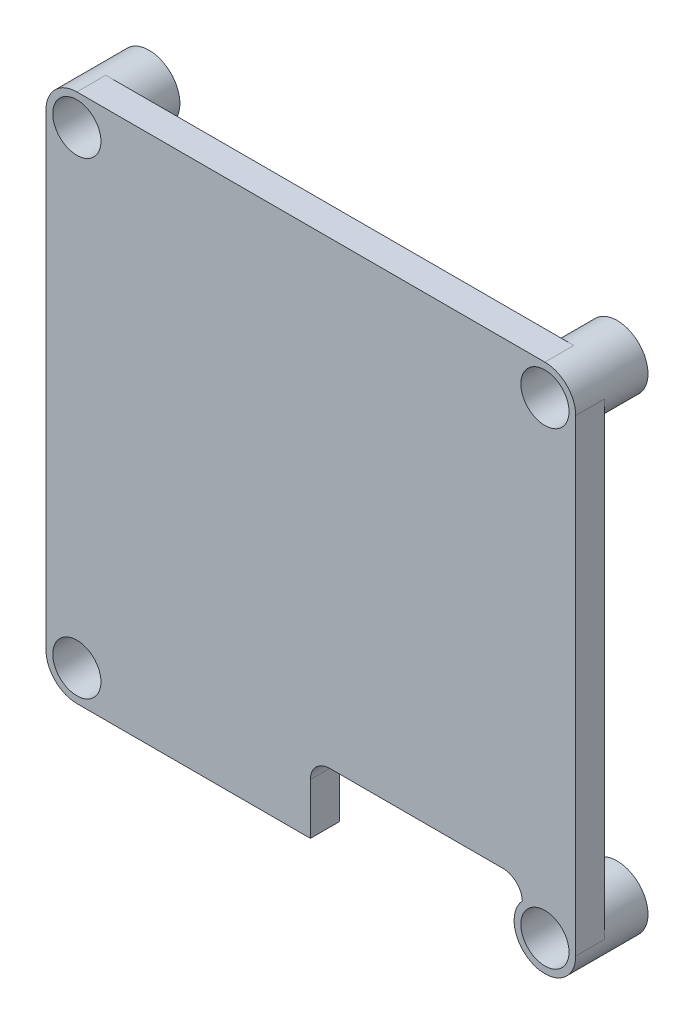
ISO-10303-21;
HEADER;
FILE_DESCRIPTION(('STEP AP214'),'2;1');
FILE_NAME('part.step','',(''),(''),'','','');
FILE_SCHEMA(('AUTOMOTIVE_DESIGN { 1 0 10303 214 1 1 1 1 }'));
ENDSEC;
DATA;
#1=APPLICATION_CONTEXT('core data for automotive mechanical design processes');
#2=APPLICATION_PROTOCOL_DEFINITION('international standard','automotive_design',2000,#1);
#3=PRODUCT_CONTEXT('',#1,'mechanical');
#4=PRODUCT('Part','Part','',(#3));
#5=PRODUCT_RELATED_PRODUCT_CATEGORY('part','',(#4));
#6=PRODUCT_DEFINITION_FORMATION('','',#4);
#7=PRODUCT_DEFINITION_CONTEXT('part definition',#1,'design');
#8=PRODUCT_DEFINITION('design','',#6,#7);
#9=PRODUCT_DEFINITION_SHAPE('','',#8);
#10=(LENGTH_UNIT() NAMED_UNIT(*) SI_UNIT(.MILLI.,.METRE.));
#11=(NAMED_UNIT(*) PLANE_ANGLE_UNIT() SI_UNIT($,.RADIAN.));
#12=(NAMED_UNIT(*) SI_UNIT($,.STERADIAN.) SOLID_ANGLE_UNIT());
#13=UNCERTAINTY_MEASURE_WITH_UNIT(LENGTH_MEASURE(1.E-05),#10,'distance_accuracy_value','');
#14=(GEOMETRIC_REPRESENTATION_CONTEXT(3) GLOBAL_UNCERTAINTY_ASSIGNED_CONTEXT((#13)) GLOBAL_UNIT_ASSIGNED_CONTEXT((#10,
#11,#12)) REPRESENTATION_CONTEXT('',''));
#15=CARTESIAN_POINT('',(0.,0.,0.));
#16=DIRECTION('',(0.,0.,1.));
#17=DIRECTION('',(1.,0.,0.));
#18=AXIS2_PLACEMENT_3D('',#15,#16,#17);
#19=CARTESIAN_POINT('',(0.,0.,2.25));
#20=DIRECTION('',(0.,0.,1.));
#21=DIRECTION('',(1.,0.,0.));
#22=AXIS2_PLACEMENT_3D('',#19,#20,#21);
#23=PLANE('',#22);
#24=CARTESIAN_POINT('',(-12.15,-12.15,2.25));
#25=DIRECTION('',(0.,0.,1.));
#26=DIRECTION('',(1.,0.,0.));
#27=AXIS2_PLACEMENT_3D('',#24,#25,#26);
#28=CIRCLE('',#27,1.6);
#29=CARTESIAN_POINT('',(-12.15,-13.75,2.25));
#30=VERTEX_POINT('',#29);
#31=CARTESIAN_POINT('',(-13.75,-12.15,2.25));
#32=VERTEX_POINT('',#31);
#33=EDGE_CURVE('E123',#30,#32,#28,.T.);
#34=ORIENTED_EDGE('',*,*,#33,.T.);
#35=DIRECTION('',(0.,-1.,0.));
#36=VECTOR('',#35,1.);
#37=CARTESIAN_POINT('',(-13.75,0.,2.25));
#38=LINE('',#37,#36);
#39=CARTESIAN_POINT('',(-13.75,12.15,2.25));
#40=VERTEX_POINT('',#39);
#41=EDGE_CURVE('E126',#40,#32,#38,.T.);
#42=ORIENTED_EDGE('',*,*,#41,.F.);
#43=CARTESIAN_POINT('',(-12.15,12.15,2.25));
#44=DIRECTION('',(0.,0.,1.));
#45=DIRECTION('',(1.,0.,0.));
#46=AXIS2_PLACEMENT_3D('',#43,#44,#45);
#47=CIRCLE('',#46,1.6);
#48=CARTESIAN_POINT('',(-12.15,13.75,2.25));
#49=VERTEX_POINT('',#48);
#50=EDGE_CURVE('E190',#40,#49,#47,.T.);
#51=ORIENTED_EDGE('',*,*,#50,.T.);
#52=DIRECTION('',(1.,0.,0.));
#53=VECTOR('',#52,1.);
#54=CARTESIAN_POINT('',(0.,13.75,2.25));
#55=LINE('',#54,#53);
#56=CARTESIAN_POINT('',(12.15,13.75,2.25));
#57=VERTEX_POINT('',#56);
#58=EDGE_CURVE('E166',#49,#57,#55,.T.);
#59=ORIENTED_EDGE('',*,*,#58,.T.);
#60=CARTESIAN_POINT('',(12.15,12.15,2.25));
#61=DIRECTION('',(0.,0.,1.));
#62=DIRECTION('',(1.,0.,0.));
#63=AXIS2_PLACEMENT_3D('',#60,#61,#62);
#64=CIRCLE('',#63,1.6);
#65=CARTESIAN_POINT('',(13.75,12.15,2.25));
#66=VERTEX_POINT('',#65);
#67=EDGE_CURVE('E149',#57,#66,#64,.T.);
#68=ORIENTED_EDGE('',*,*,#67,.T.);
#69=DIRECTION('',(0.,-1.,0.));
#70=VECTOR('',#69,1.);
#71=CARTESIAN_POINT('',(13.75,0.,2.25));
#72=LINE('',#71,#70);
#73=CARTESIAN_POINT('',(13.75,-12.15,2.25));
#74=VERTEX_POINT('',#73);
#75=EDGE_CURVE('E163',#66,#74,#72,.T.);
#76=ORIENTED_EDGE('',*,*,#75,.T.);
#77=CARTESIAN_POINT('',(12.15,-12.15,2.25));
#78=DIRECTION('',(0.,0.,1.));
#79=DIRECTION('',(1.,0.,0.));
#80=AXIS2_PLACEMENT_3D('',#77,#78,#79);
#81=CIRCLE('',#80,1.6);
#82=CARTESIAN_POINT('',(10.975,-11.0640096685513,2.25));
#83=VERTEX_POINT('',#82);
#84=EDGE_CURVE('E228',#74,#83,#81,.T.);
#85=ORIENTED_EDGE('',*,*,#84,.T.);
#86=CARTESIAN_POINT('',(9.97564786184138,-11.1,2.25));
#87=DIRECTION('',(0.,0.,1.));
#88=DIRECTION('',(1.,0.,0.));
#89=AXIS2_PLACEMENT_3D('',#86,#87,#88);
#90=CIRCLE('',#89,1.);
#91=CARTESIAN_POINT('',(9.97564786184138,-10.1,2.25));
#92=VERTEX_POINT('',#91);
#93=EDGE_CURVE('E203',#83,#92,#90,.T.);
#94=ORIENTED_EDGE('',*,*,#93,.T.);
#95=DIRECTION('',(1.,0.,0.));
#96=VECTOR('',#95,1.);
#97=CARTESIAN_POINT('',(0.,-10.1,2.25));
#98=LINE('',#97,#96);
#99=CARTESIAN_POINT('',(0.975000000000001,-10.1,2.25));
#100=VERTEX_POINT('',#99);
#101=EDGE_CURVE('E160',#100,#92,#98,.T.);
#102=ORIENTED_EDGE('',*,*,#101,.F.);
#103=CARTESIAN_POINT('',(0.975000000000001,-11.1,2.25));
#104=DIRECTION('',(0.,0.,1.));
#105=DIRECTION('',(1.,0.,0.));
#106=AXIS2_PLACEMENT_3D('',#103,#104,#105);
#107=CIRCLE('',#106,1.);
#108=CARTESIAN_POINT('',(-0.0249999999999993,-11.1,2.25));
#109=VERTEX_POINT('',#108);
#110=EDGE_CURVE('E43',#100,#109,#107,.T.);
#111=ORIENTED_EDGE('',*,*,#110,.T.);
#112=DIRECTION('',(0.,1.,0.));
#113=VECTOR('',#112,1.);
#114=CARTESIAN_POINT('',(-0.0250000000000007,0.,2.25));
#115=LINE('',#114,#113);
#116=CARTESIAN_POINT('',(-0.024999999999999,-13.75,2.25));
#117=VERTEX_POINT('',#116);
#118=EDGE_CURVE('E151',#117,#109,#115,.T.);
#119=ORIENTED_EDGE('',*,*,#118,.F.);
#120=DIRECTION('',(1.,0.,0.));
#121=VECTOR('',#120,1.);
#122=CARTESIAN_POINT('',(0.,-13.75,2.25));
#123=LINE('',#122,#121);
#124=EDGE_CURVE('E127',#30,#117,#123,.T.);
#125=ORIENTED_EDGE('',*,*,#124,.F.);
#126=EDGE_LOOP('',(#34,#42,#51,#59,#68,#76,#85,#94,#102,#111,#119,#125));
#127=FACE_BOUND('',#126,.T.);
#128=ADVANCED_FACE('F35',(#127),#23,.F.);
#129=CARTESIAN_POINT('',(-12.15,12.15,2.25));
#130=DIRECTION('',(0.,0.,-1.));
#131=DIRECTION('',(-1.,0.,0.));
#132=AXIS2_PLACEMENT_3D('',#129,#130,#131);
#133=CYLINDRICAL_SURFACE('',#132,1.25);
#134=CARTESIAN_POINT('',(-12.15,12.15,0.));
#135=DIRECTION('',(0.,0.,1.));
#136=DIRECTION('',(1.,0.,0.));
#137=AXIS2_PLACEMENT_3D('',#134,#135,#136);
#138=CIRCLE('',#137,1.25);
#139=CARTESIAN_POINT('',(-10.9,12.15,0.));
#140=VERTEX_POINT('',#139);
#141=EDGE_CURVE('E142',#140,#140,#138,.T.);
#142=ORIENTED_EDGE('',*,*,#141,.F.);
#143=EDGE_LOOP('',(#142));
#144=FACE_BOUND('',#143,.T.);
#145=CARTESIAN_POINT('',(-12.15,12.15,3.75));
#146=DIRECTION('',(0.,0.,1.));
#147=DIRECTION('',(1.,0.,0.));
#148=AXIS2_PLACEMENT_3D('',#145,#146,#147);
#149=CIRCLE('',#148,1.25);
#150=CARTESIAN_POINT('',(-10.9,12.15,3.75));
#151=VERTEX_POINT('',#150);
#152=EDGE_CURVE('E259',#151,#151,#149,.F.);
#153=ORIENTED_EDGE('',*,*,#152,.F.);
#154=EDGE_LOOP('',(#153));
#155=FACE_BOUND('',#154,.T.);
#156=ADVANCED_FACE('F288',(#144,#155),#133,.F.);
#157=CARTESIAN_POINT('',(-12.15,12.15,2.25));
#158=DIRECTION('',(0.,0.,-1.));
#159=DIRECTION('',(-1.,0.,0.));
#160=AXIS2_PLACEMENT_3D('',#157,#158,#159);
#161=CYLINDRICAL_SURFACE('',#160,1.6);
#162=ORIENTED_EDGE('',*,*,#50,.F.);
#163=DIRECTION('',(0.,0.,-1.));
#164=VECTOR('',#163,1.);
#165=CARTESIAN_POINT('',(-13.75,12.15,3.75));
#166=LINE('',#165,#164);
#167=CARTESIAN_POINT('',(-13.75,12.15,3.75));
#168=VERTEX_POINT('',#167);
#169=EDGE_CURVE('E148',#168,#40,#166,.T.);
#170=ORIENTED_EDGE('',*,*,#169,.F.);
#171=CARTESIAN_POINT('',(-12.15,12.15,3.75));
#172=DIRECTION('',(0.,0.,1.));
#173=DIRECTION('',(1.,0.,0.));
#174=AXIS2_PLACEMENT_3D('',#171,#172,#173);
#175=CIRCLE('',#174,1.6);
#176=CARTESIAN_POINT('',(-12.15,13.75,3.75));
#177=VERTEX_POINT('',#176);
#178=EDGE_CURVE('E257',#177,#168,#175,.T.);
#179=ORIENTED_EDGE('',*,*,#178,.F.);
#180=DIRECTION('',(0.,0.,-1.));
#181=VECTOR('',#180,1.);
#182=CARTESIAN_POINT('',(-12.15,13.75,3.75));
#183=LINE('',#182,#181);
#184=EDGE_CURVE('E171',#177,#49,#183,.T.);
#185=ORIENTED_EDGE('',*,*,#184,.T.);
#186=EDGE_LOOP('',(#162,#170,#179,#185));
#187=FACE_BOUND('',#186,.T.);
#188=CARTESIAN_POINT('',(-12.15,12.15,0.));
#189=DIRECTION('',(0.,0.,1.));
#190=DIRECTION('',(1.,0.,0.));
#191=AXIS2_PLACEMENT_3D('',#188,#189,#190);
#192=CIRCLE('',#191,1.6);
#193=CARTESIAN_POINT('',(-10.55,12.15,0.));
#194=VERTEX_POINT('',#193);
#195=EDGE_CURVE('E193',#194,#194,#192,.T.);
#196=ORIENTED_EDGE('',*,*,#195,.T.);
#197=EDGE_LOOP('',(#196));
#198=FACE_BOUND('',#197,.T.);
#199=ADVANCED_FACE('F292',(#187,#198),#161,.T.);
#200=CARTESIAN_POINT('',(0.,0.,0.));
#201=DIRECTION('',(0.,0.,1.));
#202=DIRECTION('',(1.,0.,0.));
#203=AXIS2_PLACEMENT_3D('',#200,#201,#202);
#204=PLANE('',#203);
#205=ORIENTED_EDGE('',*,*,#141,.T.);
#206=EDGE_LOOP('',(#205));
#207=FACE_BOUND('',#206,.T.);
#208=ORIENTED_EDGE('',*,*,#195,.F.);
#209=EDGE_LOOP('',(#208));
#210=FACE_BOUND('',#209,.T.);
#211=ADVANCED_FACE('F331',(#207,#210),#204,.F.);
#212=CARTESIAN_POINT('',(-13.75,0.,3.75));
#213=DIRECTION('',(1.,0.,0.));
#214=DIRECTION('',(0.,1.,0.));
#215=AXIS2_PLACEMENT_3D('',#212,#213,#214);
#216=PLANE('',#215);
#217=ORIENTED_EDGE('',*,*,#41,.T.);
#218=DIRECTION('',(0.,0.,-1.));
#219=VECTOR('',#218,1.);
#220=CARTESIAN_POINT('',(-13.75,-12.15,3.75));
#221=LINE('',#220,#219);
#222=CARTESIAN_POINT('',(-13.75,-12.15,3.75));
#223=VERTEX_POINT('',#222);
#224=EDGE_CURVE('E135',#223,#32,#221,.T.);
#225=ORIENTED_EDGE('',*,*,#224,.F.);
#226=DIRECTION('',(0.,-1.,0.));
#227=VECTOR('',#226,1.);
#228=CARTESIAN_POINT('',(-13.75,0.,3.75));
#229=LINE('',#228,#227);
#230=EDGE_CURVE('E169',#168,#223,#229,.T.);
#231=ORIENTED_EDGE('',*,*,#230,.F.);
#232=ORIENTED_EDGE('',*,*,#169,.T.);
#233=EDGE_LOOP('',(#217,#225,#231,#232));
#234=FACE_BOUND('',#233,.T.);
#235=ADVANCED_FACE('F146',(#234),#216,.F.);
#236=CARTESIAN_POINT('',(-12.15,-12.15,3.75));
#237=DIRECTION('',(0.,0.,-1.));
#238=DIRECTION('',(-1.,0.,0.));
#239=AXIS2_PLACEMENT_3D('',#236,#237,#238);
#240=CYLINDRICAL_SURFACE('',#239,1.6);
#241=ORIENTED_EDGE('',*,*,#224,.T.);
#242=ORIENTED_EDGE('',*,*,#33,.F.);
#243=DIRECTION('',(0.,0.,-1.));
#244=VECTOR('',#243,1.);
#245=CARTESIAN_POINT('',(-12.15,-13.75,3.75));
#246=LINE('',#245,#244);
#247=CARTESIAN_POINT('',(-12.15,-13.75,3.75));
#248=VERTEX_POINT('',#247);
#249=EDGE_CURVE('E143',#248,#30,#246,.T.);
#250=ORIENTED_EDGE('',*,*,#249,.F.);
#251=CARTESIAN_POINT('',(-12.15,-12.15,3.75));
#252=DIRECTION('',(0.,0.,1.));
#253=DIRECTION('',(1.,0.,0.));
#254=AXIS2_PLACEMENT_3D('',#251,#252,#253);
#255=CIRCLE('',#254,1.6);
#256=EDGE_CURVE('E138',#223,#248,#255,.T.);
#257=ORIENTED_EDGE('',*,*,#256,.F.);
#258=EDGE_LOOP('',(#241,#242,#250,#257));
#259=FACE_BOUND('',#258,.T.);
#260=CARTESIAN_POINT('',(-12.15,-12.15,0.));
#261=DIRECTION('',(0.,0.,1.));
#262=DIRECTION('',(1.,0.,0.));
#263=AXIS2_PLACEMENT_3D('',#260,#261,#262);
#264=CIRCLE('',#263,1.6);
#265=CARTESIAN_POINT('',(-10.55,-12.15,0.));
#266=VERTEX_POINT('',#265);
#267=EDGE_CURVE('E132',#266,#266,#264,.T.);
#268=ORIENTED_EDGE('',*,*,#267,.T.);
#269=EDGE_LOOP('',(#268));
#270=FACE_BOUND('',#269,.T.);
#271=ADVANCED_FACE('F136',(#259,#270),#240,.T.);
#272=CARTESIAN_POINT('',(0.,-13.75,3.75));
#273=DIRECTION('',(0.,1.,0.));
#274=DIRECTION('',(0.,0.,1.));
#275=AXIS2_PLACEMENT_3D('',#272,#273,#274);
#276=PLANE('',#275);
#277=ORIENTED_EDGE('',*,*,#124,.T.);
#278=DIRECTION('',(0.,0.,-1.));
#279=VECTOR('',#278,1.);
#280=CARTESIAN_POINT('',(-0.024999999999999,-13.75,3.75));
#281=LINE('',#280,#279);
#282=CARTESIAN_POINT('',(-0.024999999999999,-13.75,3.75));
#283=VERTEX_POINT('',#282);
#284=EDGE_CURVE('E186',#283,#117,#281,.T.);
#285=ORIENTED_EDGE('',*,*,#284,.F.);
#286=DIRECTION('',(1.,0.,0.));
#287=VECTOR('',#286,1.);
#288=CARTESIAN_POINT('',(0.,-13.75,3.75));
#289=LINE('',#288,#287);
#290=EDGE_CURVE('E246',#248,#283,#289,.T.);
#291=ORIENTED_EDGE('',*,*,#290,.F.);
#292=ORIENTED_EDGE('',*,*,#249,.T.);
#293=EDGE_LOOP('',(#277,#285,#291,#292));
#294=FACE_BOUND('',#293,.T.);
#295=ADVANCED_FACE('F323',(#294),#276,.F.);
#296=CARTESIAN_POINT('',(-0.0250000000000007,0.,3.75));
#297=DIRECTION('',(-1.,0.,0.));
#298=DIRECTION('',(0.,-1.,0.));
#299=AXIS2_PLACEMENT_3D('',#296,#297,#298);
#300=PLANE('',#299);
#301=ORIENTED_EDGE('',*,*,#118,.T.);
#302=DIRECTION('',(0.,0.,-1.));
#303=VECTOR('',#302,1.);
#304=CARTESIAN_POINT('',(-0.0249999999999993,-11.1,3.75));
#305=LINE('',#304,#303);
#306=CARTESIAN_POINT('',(-0.0249999999999993,-11.1,3.75));
#307=VERTEX_POINT('',#306);
#308=EDGE_CURVE('E50',#109,#307,#305,.F.);
#309=ORIENTED_EDGE('',*,*,#308,.T.);
#310=DIRECTION('',(0.,1.,0.));
#311=VECTOR('',#310,1.);
#312=CARTESIAN_POINT('',(-0.0250000000000007,0.,3.75));
#313=LINE('',#312,#311);
#314=EDGE_CURVE('E248',#283,#307,#313,.T.);
#315=ORIENTED_EDGE('',*,*,#314,.F.);
#316=ORIENTED_EDGE('',*,*,#284,.T.);
#317=EDGE_LOOP('',(#301,#309,#315,#316));
#318=FACE_BOUND('',#317,.T.);
#319=ADVANCED_FACE('F319',(#318),#300,.F.);
#320=CARTESIAN_POINT('',(0.,-10.1,3.75));
#321=DIRECTION('',(0.,1.,0.));
#322=DIRECTION('',(0.,0.,1.));
#323=AXIS2_PLACEMENT_3D('',#320,#321,#322);
#324=PLANE('',#323);
#325=ORIENTED_EDGE('',*,*,#101,.T.);
#326=DIRECTION('',(0.,0.,-1.));
#327=VECTOR('',#326,1.);
#328=CARTESIAN_POINT('',(9.97564786184138,-10.1,3.75));
#329=LINE('',#328,#327);
#330=CARTESIAN_POINT('',(9.97564786184138,-10.1,3.75));
#331=VERTEX_POINT('',#330);
#332=EDGE_CURVE('E200',#92,#331,#329,.F.);
#333=ORIENTED_EDGE('',*,*,#332,.T.);
#334=DIRECTION('',(1.,0.,0.));
#335=VECTOR('',#334,1.);
#336=CARTESIAN_POINT('',(0.,-10.1,3.75));
#337=LINE('',#336,#335);
#338=CARTESIAN_POINT('',(0.975000000000001,-10.1,3.75));
#339=VERTEX_POINT('',#338);
#340=EDGE_CURVE('E216',#339,#331,#337,.T.);
#341=ORIENTED_EDGE('',*,*,#340,.F.);
#342=DIRECTION('',(0.,0.,-1.));
#343=VECTOR('',#342,1.);
#344=CARTESIAN_POINT('',(0.975000000000001,-10.1,2.25));
#345=LINE('',#344,#343);
#346=EDGE_CURVE('E192',#339,#100,#345,.T.);
#347=ORIENTED_EDGE('',*,*,#346,.T.);
#348=EDGE_LOOP('',(#325,#333,#341,#347));
#349=FACE_BOUND('',#348,.T.);
#350=ADVANCED_FACE('F316',(#349),#324,.F.);
#351=CARTESIAN_POINT('',(12.15,-12.15,3.75));
#352=DIRECTION('',(0.,0.,-1.));
#353=DIRECTION('',(-1.,0.,0.));
#354=AXIS2_PLACEMENT_3D('',#351,#352,#353);
#355=CYLINDRICAL_SURFACE('',#354,1.6);
#356=DIRECTION('',(0.,0.,-1.));
#357=VECTOR('',#356,1.);
#358=CARTESIAN_POINT('',(10.975,-11.0640096685513,3.75));
#359=LINE('',#358,#357);
#360=CARTESIAN_POINT('',(10.975,-11.0640096685513,3.75));
#361=VERTEX_POINT('',#360);
#362=EDGE_CURVE('E183',#361,#83,#359,.T.);
#363=ORIENTED_EDGE('',*,*,#362,.T.);
#364=ORIENTED_EDGE('',*,*,#84,.F.);
#365=DIRECTION('',(0.,0.,-1.));
#366=VECTOR('',#365,1.);
#367=CARTESIAN_POINT('',(13.75,-12.15,3.75));
#368=LINE('',#367,#366);
#369=CARTESIAN_POINT('',(13.75,-12.15,3.75));
#370=VERTEX_POINT('',#369);
#371=EDGE_CURVE('E180',#370,#74,#368,.T.);
#372=ORIENTED_EDGE('',*,*,#371,.F.);
#373=CARTESIAN_POINT('',(12.15,-12.15,3.75));
#374=DIRECTION('',(0.,0.,1.));
#375=DIRECTION('',(1.,0.,0.));
#376=AXIS2_PLACEMENT_3D('',#373,#374,#375);
#377=CIRCLE('',#376,1.6);
#378=EDGE_CURVE('E213',#361,#370,#377,.T.);
#379=ORIENTED_EDGE('',*,*,#378,.F.);
#380=EDGE_LOOP('',(#363,#364,#372,#379));
#381=FACE_BOUND('',#380,.T.);
#382=CARTESIAN_POINT('',(12.15,-12.15,0.));
#383=DIRECTION('',(0.,0.,1.));
#384=DIRECTION('',(1.,0.,0.));
#385=AXIS2_PLACEMENT_3D('',#382,#383,#384);
#386=CIRCLE('',#385,1.6);
#387=CARTESIAN_POINT('',(13.75,-12.15,0.));
#388=VERTEX_POINT('',#387);
#389=EDGE_CURVE('E231',#388,#388,#386,.T.);
#390=ORIENTED_EDGE('',*,*,#389,.T.);
#391=EDGE_LOOP('',(#390));
#392=FACE_BOUND('',#391,.T.);
#393=ADVANCED_FACE('F221',(#381,#392),#355,.T.);
#394=CARTESIAN_POINT('',(13.75,0.,3.75));
#395=DIRECTION('',(1.,0.,0.));
#396=DIRECTION('',(0.,1.,0.));
#397=AXIS2_PLACEMENT_3D('',#394,#395,#396);
#398=PLANE('',#397);
#399=ORIENTED_EDGE('',*,*,#75,.F.);
#400=DIRECTION('',(0.,0.,-1.));
#401=VECTOR('',#400,1.);
#402=CARTESIAN_POINT('',(13.75,12.15,3.75));
#403=LINE('',#402,#401);
#404=CARTESIAN_POINT('',(13.75,12.15,3.75));
#405=VERTEX_POINT('',#404);
#406=EDGE_CURVE('E177',#405,#66,#403,.T.);
#407=ORIENTED_EDGE('',*,*,#406,.F.);
#408=DIRECTION('',(0.,-1.,0.));
#409=VECTOR('',#408,1.);
#410=CARTESIAN_POINT('',(13.75,0.,3.75));
#411=LINE('',#410,#409);
#412=EDGE_CURVE('E224',#405,#370,#411,.T.);
#413=ORIENTED_EDGE('',*,*,#412,.T.);
#414=ORIENTED_EDGE('',*,*,#371,.T.);
#415=EDGE_LOOP('',(#399,#407,#413,#414));
#416=FACE_BOUND('',#415,.T.);
#417=ADVANCED_FACE('F309',(#416),#398,.T.);
#418=CARTESIAN_POINT('',(12.15,12.15,3.75));
#419=DIRECTION('',(0.,0.,-1.));
#420=DIRECTION('',(-1.,0.,0.));
#421=AXIS2_PLACEMENT_3D('',#418,#419,#420);
#422=CYLINDRICAL_SURFACE('',#421,1.6);
#423=ORIENTED_EDGE('',*,*,#406,.T.);
#424=ORIENTED_EDGE('',*,*,#67,.F.);
#425=DIRECTION('',(0.,0.,-1.));
#426=VECTOR('',#425,1.);
#427=CARTESIAN_POINT('',(12.15,13.75,3.75));
#428=LINE('',#427,#426);
#429=CARTESIAN_POINT('',(12.15,13.75,3.75));
#430=VERTEX_POINT('',#429);
#431=EDGE_CURVE('E174',#430,#57,#428,.T.);
#432=ORIENTED_EDGE('',*,*,#431,.F.);
#433=CARTESIAN_POINT('',(12.15,12.15,3.75));
#434=DIRECTION('',(0.,0.,1.));
#435=DIRECTION('',(1.,0.,0.));
#436=AXIS2_PLACEMENT_3D('',#433,#434,#435);
#437=CIRCLE('',#436,1.6);
#438=EDGE_CURVE('E252',#405,#430,#437,.T.);
#439=ORIENTED_EDGE('',*,*,#438,.F.);
#440=EDGE_LOOP('',(#423,#424,#432,#439));
#441=FACE_BOUND('',#440,.T.);
#442=CARTESIAN_POINT('',(12.15,12.15,0.));
#443=DIRECTION('',(0.,0.,1.));
#444=DIRECTION('',(1.,0.,0.));
#445=AXIS2_PLACEMENT_3D('',#442,#443,#444);
#446=CIRCLE('',#445,1.6);
#447=CARTESIAN_POINT('',(13.75,12.15,0.));
#448=VERTEX_POINT('',#447);
#449=EDGE_CURVE('E153',#448,#448,#446,.T.);
#450=ORIENTED_EDGE('',*,*,#449,.T.);
#451=EDGE_LOOP('',(#450));
#452=FACE_BOUND('',#451,.T.);
#453=ADVANCED_FACE('F305',(#441,#452),#422,.T.);
#454=CARTESIAN_POINT('',(0.,13.75,3.75));
#455=DIRECTION('',(0.,1.,0.));
#456=DIRECTION('',(0.,0.,1.));
#457=AXIS2_PLACEMENT_3D('',#454,#455,#456);
#458=PLANE('',#457);
#459=ORIENTED_EDGE('',*,*,#58,.F.);
#460=ORIENTED_EDGE('',*,*,#184,.F.);
#461=DIRECTION('',(1.,0.,0.));
#462=VECTOR('',#461,1.);
#463=CARTESIAN_POINT('',(0.,13.75,3.75));
#464=LINE('',#463,#462);
#465=EDGE_CURVE('E254',#177,#430,#464,.T.);
#466=ORIENTED_EDGE('',*,*,#465,.T.);
#467=ORIENTED_EDGE('',*,*,#431,.T.);
#468=EDGE_LOOP('',(#459,#460,#466,#467));
#469=FACE_BOUND('',#468,.T.);
#470=ADVANCED_FACE('F299',(#469),#458,.T.);
#471=CARTESIAN_POINT('',(12.15,-12.15,3.75));
#472=DIRECTION('',(0.,0.,-1.));
#473=DIRECTION('',(-1.,0.,0.));
#474=AXIS2_PLACEMENT_3D('',#471,#472,#473);
#475=CYLINDRICAL_SURFACE('',#474,1.25);
#476=CARTESIAN_POINT('',(12.15,-12.15,3.75));
#477=DIRECTION('',(0.,0.,1.));
#478=DIRECTION('',(1.,0.,0.));
#479=AXIS2_PLACEMENT_3D('',#476,#477,#478);
#480=CIRCLE('',#479,1.25);
#481=CARTESIAN_POINT('',(13.4,-12.15,3.75));
#482=VERTEX_POINT('',#481);
#483=EDGE_CURVE('E264',#482,#482,#480,.T.);
#484=ORIENTED_EDGE('',*,*,#483,.T.);
#485=EDGE_LOOP('',(#484));
#486=FACE_BOUND('',#485,.T.);
#487=CARTESIAN_POINT('',(12.15,-12.15,0.));
#488=DIRECTION('',(0.,0.,1.));
#489=DIRECTION('',(1.,0.,0.));
#490=AXIS2_PLACEMENT_3D('',#487,#488,#489);
#491=CIRCLE('',#490,1.25);
#492=CARTESIAN_POINT('',(13.4,-12.15,0.));
#493=VERTEX_POINT('',#492);
#494=EDGE_CURVE('E131',#493,#493,#491,.T.);
#495=ORIENTED_EDGE('',*,*,#494,.F.);
#496=EDGE_LOOP('',(#495));
#497=FACE_BOUND('',#496,.T.);
#498=ADVANCED_FACE('F296',(#486,#497),#475,.F.);
#499=CARTESIAN_POINT('',(12.15,12.15,3.75));
#500=DIRECTION('',(0.,0.,-1.));
#501=DIRECTION('',(-1.,0.,0.));
#502=AXIS2_PLACEMENT_3D('',#499,#500,#501);
#503=CYLINDRICAL_SURFACE('',#502,1.25);
#504=CARTESIAN_POINT('',(12.15,12.15,3.75));
#505=DIRECTION('',(0.,0.,1.));
#506=DIRECTION('',(1.,0.,0.));
#507=AXIS2_PLACEMENT_3D('',#504,#505,#506);
#508=CIRCLE('',#507,1.25);
#509=CARTESIAN_POINT('',(13.4,12.15,3.75));
#510=VERTEX_POINT('',#509);
#511=EDGE_CURVE('E262',#510,#510,#508,.T.);
#512=ORIENTED_EDGE('',*,*,#511,.T.);
#513=EDGE_LOOP('',(#512));
#514=FACE_BOUND('',#513,.T.);
#515=CARTESIAN_POINT('',(12.15,12.15,0.));
#516=DIRECTION('',(0.,0.,1.));
#517=DIRECTION('',(1.,0.,0.));
#518=AXIS2_PLACEMENT_3D('',#515,#516,#517);
#519=CIRCLE('',#518,1.25);
#520=CARTESIAN_POINT('',(13.4,12.15,0.));
#521=VERTEX_POINT('',#520);
#522=EDGE_CURVE('E230',#521,#521,#519,.T.);
#523=ORIENTED_EDGE('',*,*,#522,.F.);
#524=EDGE_LOOP('',(#523));
#525=FACE_BOUND('',#524,.T.);
#526=ADVANCED_FACE('F284',(#514,#525),#503,.F.);
#527=CARTESIAN_POINT('',(-12.15,-12.15,3.75));
#528=DIRECTION('',(0.,0.,-1.));
#529=DIRECTION('',(-1.,0.,0.));
#530=AXIS2_PLACEMENT_3D('',#527,#528,#529);
#531=CYLINDRICAL_SURFACE('',#530,1.25);
#532=CARTESIAN_POINT('',(-12.15,-12.15,3.75));
#533=DIRECTION('',(0.,0.,1.));
#534=DIRECTION('',(1.,0.,0.));
#535=AXIS2_PLACEMENT_3D('',#532,#533,#534);
#536=CIRCLE('',#535,1.25);
#537=CARTESIAN_POINT('',(-10.9,-12.15,3.75));
#538=VERTEX_POINT('',#537);
#539=EDGE_CURVE('E156',#538,#538,#536,.T.);
#540=ORIENTED_EDGE('',*,*,#539,.T.);
#541=EDGE_LOOP('',(#540));
#542=FACE_BOUND('',#541,.T.);
#543=CARTESIAN_POINT('',(-12.15,-12.15,0.));
#544=DIRECTION('',(0.,0.,1.));
#545=DIRECTION('',(1.,0.,0.));
#546=AXIS2_PLACEMENT_3D('',#543,#544,#545);
#547=CIRCLE('',#546,1.25);
#548=CARTESIAN_POINT('',(-10.9,-12.15,0.));
#549=VERTEX_POINT('',#548);
#550=EDGE_CURVE('E354',#549,#549,#547,.T.);
#551=ORIENTED_EDGE('',*,*,#550,.F.);
#552=EDGE_LOOP('',(#551));
#553=FACE_BOUND('',#552,.T.);
#554=ADVANCED_FACE('F271',(#542,#553),#531,.F.);
#555=CARTESIAN_POINT('',(0.,0.,3.75));
#556=DIRECTION('',(0.,0.,1.));
#557=DIRECTION('',(1.,0.,0.));
#558=AXIS2_PLACEMENT_3D('',#555,#556,#557);
#559=PLANE('',#558);
#560=ORIENTED_EDGE('',*,*,#230,.T.);
#561=ORIENTED_EDGE('',*,*,#256,.T.);
#562=ORIENTED_EDGE('',*,*,#290,.T.);
#563=ORIENTED_EDGE('',*,*,#314,.T.);
#564=CARTESIAN_POINT('',(0.975000000000001,-11.1,3.75));
#565=DIRECTION('',(0.,0.,1.));
#566=DIRECTION('',(1.,0.,0.));
#567=AXIS2_PLACEMENT_3D('',#564,#565,#566);
#568=CIRCLE('',#567,1.);
#569=EDGE_CURVE('E11',#307,#339,#568,.F.);
#570=ORIENTED_EDGE('',*,*,#569,.T.);
#571=ORIENTED_EDGE('',*,*,#340,.T.);
#572=CARTESIAN_POINT('',(9.97564786184138,-11.1,3.75));
#573=DIRECTION('',(0.,0.,1.));
#574=DIRECTION('',(1.,0.,0.));
#575=AXIS2_PLACEMENT_3D('',#572,#573,#574);
#576=CIRCLE('',#575,1.);
#577=EDGE_CURVE('E205',#331,#361,#576,.F.);
#578=ORIENTED_EDGE('',*,*,#577,.T.);
#579=ORIENTED_EDGE('',*,*,#378,.T.);
#580=ORIENTED_EDGE('',*,*,#412,.F.);
#581=ORIENTED_EDGE('',*,*,#438,.T.);
#582=ORIENTED_EDGE('',*,*,#465,.F.);
#583=ORIENTED_EDGE('',*,*,#178,.T.);
#584=EDGE_LOOP('',(#560,#561,#562,#563,#570,#571,#578,#579,#580,#581,#582,#583));
#585=FACE_BOUND('',#584,.T.);
#586=ORIENTED_EDGE('',*,*,#152,.T.);
#587=EDGE_LOOP('',(#586));
#588=FACE_BOUND('',#587,.T.);
#589=ORIENTED_EDGE('',*,*,#511,.F.);
#590=EDGE_LOOP('',(#589));
#591=FACE_BOUND('',#590,.T.);
#592=ORIENTED_EDGE('',*,*,#483,.F.);
#593=EDGE_LOOP('',(#592));
#594=FACE_BOUND('',#593,.T.);
#595=ORIENTED_EDGE('',*,*,#539,.F.);
#596=EDGE_LOOP('',(#595));
#597=FACE_BOUND('',#596,.T.);
#598=ADVANCED_FACE('F210',(#585,#588,#591,#594,#597),#559,.T.);
#599=CARTESIAN_POINT('',(0.,0.,0.));
#600=DIRECTION('',(0.,0.,1.));
#601=DIRECTION('',(1.,0.,0.));
#602=AXIS2_PLACEMENT_3D('',#599,#600,#601);
#603=PLANE('',#602);
#604=ORIENTED_EDGE('',*,*,#522,.T.);
#605=EDGE_LOOP('',(#604));
#606=FACE_BOUND('',#605,.T.);
#607=ORIENTED_EDGE('',*,*,#449,.F.);
#608=EDGE_LOOP('',(#607));
#609=FACE_BOUND('',#608,.T.);
#610=ADVANCED_FACE('F275',(#606,#609),#603,.F.);
#611=CARTESIAN_POINT('',(0.,0.,0.));
#612=DIRECTION('',(0.,0.,1.));
#613=DIRECTION('',(1.,0.,0.));
#614=AXIS2_PLACEMENT_3D('',#611,#612,#613);
#615=PLANE('',#614);
#616=ORIENTED_EDGE('',*,*,#494,.T.);
#617=EDGE_LOOP('',(#616));
#618=FACE_BOUND('',#617,.T.);
#619=ORIENTED_EDGE('',*,*,#389,.F.);
#620=EDGE_LOOP('',(#619));
#621=FACE_BOUND('',#620,.T.);
#622=ADVANCED_FACE('F281',(#618,#621),#615,.F.);
#623=CARTESIAN_POINT('',(0.,0.,0.));
#624=DIRECTION('',(0.,0.,1.));
#625=DIRECTION('',(1.,0.,0.));
#626=AXIS2_PLACEMENT_3D('',#623,#624,#625);
#627=PLANE('',#626);
#628=ORIENTED_EDGE('',*,*,#550,.T.);
#629=EDGE_LOOP('',(#628));
#630=FACE_BOUND('',#629,.T.);
#631=ORIENTED_EDGE('',*,*,#267,.F.);
#632=EDGE_LOOP('',(#631));
#633=FACE_BOUND('',#632,.T.);
#634=ADVANCED_FACE('F338',(#630,#633),#627,.F.);
#635=CARTESIAN_POINT('',(9.97564786184138,-11.1,3.75));
#636=DIRECTION('',(0.,0.,-1.));
#637=DIRECTION('',(-1.,0.,0.));
#638=AXIS2_PLACEMENT_3D('',#635,#636,#637);
#639=CYLINDRICAL_SURFACE('',#638,1.);
#640=ORIENTED_EDGE('',*,*,#577,.F.);
#641=ORIENTED_EDGE('',*,*,#332,.F.);
#642=ORIENTED_EDGE('',*,*,#93,.F.);
#643=ORIENTED_EDGE('',*,*,#362,.F.);
#644=EDGE_LOOP('',(#640,#641,#642,#643));
#645=FACE_BOUND('',#644,.T.);
#646=ADVANCED_FACE('F226',(#645),#639,.F.);
#647=CARTESIAN_POINT('',(0.975000000000001,-11.1,3.75));
#648=DIRECTION('',(0.,0.,1.));
#649=DIRECTION('',(1.,0.,0.));
#650=AXIS2_PLACEMENT_3D('',#647,#648,#649);
#651=CYLINDRICAL_SURFACE('',#650,1.);
#652=ORIENTED_EDGE('',*,*,#569,.F.);
#653=ORIENTED_EDGE('',*,*,#308,.F.);
#654=ORIENTED_EDGE('',*,*,#110,.F.);
#655=ORIENTED_EDGE('',*,*,#346,.F.);
#656=EDGE_LOOP('',(#652,#653,#654,#655));
#657=FACE_BOUND('',#656,.T.);
#658=ADVANCED_FACE('F37',(#657),#651,.F.);
#659=CLOSED_SHELL('',(#128,#156,#199,#211,#235,#271,#295,#319,#350,#393,#417,#453,#470,#498,
#526,#554,#598,#610,#622,#634,#646,#658));
#660=MANIFOLD_SOLID_BREP('B2',#659);
#661=ADVANCED_BREP_SHAPE_REPRESENTATION('',(#18,#660),#14);
#662=SHAPE_DEFINITION_REPRESENTATION(#9,#661);
ENDSEC;
END-ISO-10303-21;
